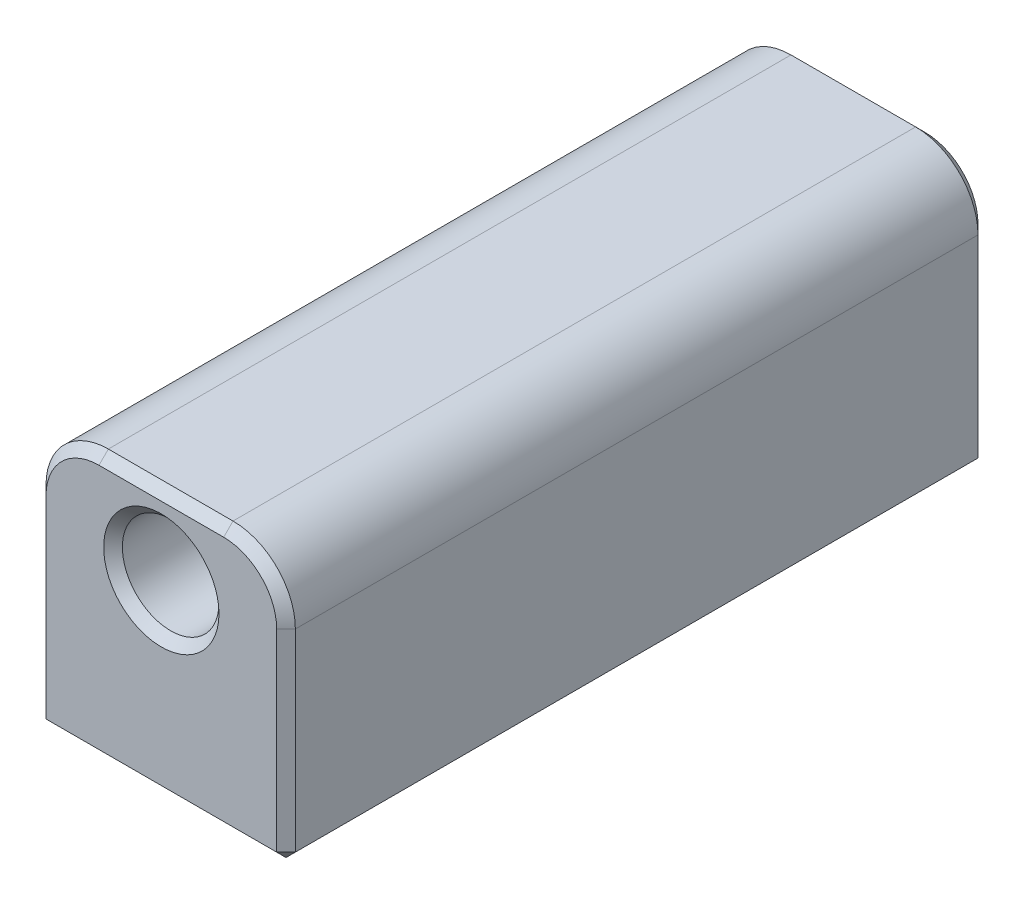
ISO-10303-21;
HEADER;
FILE_DESCRIPTION(('STEP AP214'),'2;1');
FILE_NAME('part.step','',(''),(''),'','','');
FILE_SCHEMA(('AUTOMOTIVE_DESIGN { 1 0 10303 214 1 1 1 1 }'));
ENDSEC;
DATA;
#1=APPLICATION_CONTEXT('core data for automotive mechanical design processes');
#2=APPLICATION_PROTOCOL_DEFINITION('international standard','automotive_design',2000,#1);
#3=PRODUCT_CONTEXT('',#1,'mechanical');
#4=PRODUCT('Part','Part','',(#3));
#5=PRODUCT_RELATED_PRODUCT_CATEGORY('part','',(#4));
#6=PRODUCT_DEFINITION_FORMATION('','',#4);
#7=PRODUCT_DEFINITION_CONTEXT('part definition',#1,'design');
#8=PRODUCT_DEFINITION('design','',#6,#7);
#9=PRODUCT_DEFINITION_SHAPE('','',#8);
#10=(LENGTH_UNIT() NAMED_UNIT(*) SI_UNIT(.MILLI.,.METRE.));
#11=(NAMED_UNIT(*) PLANE_ANGLE_UNIT() SI_UNIT($,.RADIAN.));
#12=(NAMED_UNIT(*) SI_UNIT($,.STERADIAN.) SOLID_ANGLE_UNIT());
#13=UNCERTAINTY_MEASURE_WITH_UNIT(LENGTH_MEASURE(1.E-05),#10,'distance_accuracy_value','');
#14=(GEOMETRIC_REPRESENTATION_CONTEXT(3) GLOBAL_UNCERTAINTY_ASSIGNED_CONTEXT((#13)) GLOBAL_UNIT_ASSIGNED_CONTEXT((#10,
#11,#12)) REPRESENTATION_CONTEXT('',''));
#15=CARTESIAN_POINT('',(0.,0.,0.));
#16=DIRECTION('',(0.,0.,1.));
#17=DIRECTION('',(1.,0.,0.));
#18=AXIS2_PLACEMENT_3D('',#15,#16,#17);
#19=CARTESIAN_POINT('',(-5.08,10.795,0.));
#20=DIRECTION('',(-1.,0.,0.));
#21=DIRECTION('',(0.,0.,1.));
#22=AXIS2_PLACEMENT_3D('',#19,#20,#21);
#23=PLANE('',#22);
#24=DIRECTION('',(0.,0.,-1.));
#25=VECTOR('',#24,1.);
#26=CARTESIAN_POINT('',(-5.08,8.255,0.));
#27=LINE('',#26,#25);
#28=CARTESIAN_POINT('',(-5.08,8.255,13.9065));
#29=VERTEX_POINT('',#28);
#30=CARTESIAN_POINT('',(-5.08,8.255,-13.9065));
#31=VERTEX_POINT('',#30);
#32=EDGE_CURVE('E205',#29,#31,#27,.T.);
#33=ORIENTED_EDGE('',*,*,#32,.T.);
#34=DIRECTION('',(0.,-1.,0.));
#35=VECTOR('',#34,1.);
#36=CARTESIAN_POINT('',(-5.08,0.,-13.9065));
#37=LINE('',#36,#35);
#38=CARTESIAN_POINT('',(-5.08,0.380999999999999,-13.9065));
#39=VERTEX_POINT('',#38);
#40=EDGE_CURVE('E376',#31,#39,#37,.T.);
#41=ORIENTED_EDGE('',*,*,#40,.T.);
#42=DIRECTION('',(0.,0.,1.));
#43=VECTOR('',#42,1.);
#44=CARTESIAN_POINT('',(-5.08,0.380999999999999,14.2875));
#45=LINE('',#44,#43);
#46=CARTESIAN_POINT('',(-5.08,0.380999999999999,13.9065));
#47=VERTEX_POINT('',#46);
#48=EDGE_CURVE('E369',#39,#47,#45,.T.);
#49=ORIENTED_EDGE('',*,*,#48,.T.);
#50=DIRECTION('',(0.,1.,0.));
#51=VECTOR('',#50,1.);
#52=CARTESIAN_POINT('',(-5.08,10.795,13.9065));
#53=LINE('',#52,#51);
#54=EDGE_CURVE('E373',#47,#29,#53,.T.);
#55=ORIENTED_EDGE('',*,*,#54,.T.);
#56=EDGE_LOOP('',(#33,#41,#49,#55));
#57=FACE_BOUND('',#56,.T.);
#58=ADVANCED_FACE('F52',(#57),#23,.T.);
#59=CARTESIAN_POINT('',(0.,10.795,14.2875));
#60=DIRECTION('',(0.,0.,1.));
#61=DIRECTION('',(1.,0.,0.));
#62=AXIS2_PLACEMENT_3D('',#59,#60,#61);
#63=PLANE('',#62);
#64=CARTESIAN_POINT('',(0.,7.62,14.2875));
#65=DIRECTION('',(0.,0.,1.));
#66=DIRECTION('',(1.,0.,0.));
#67=AXIS2_PLACEMENT_3D('',#64,#65,#66);
#68=CIRCLE('',#67,2.34950000000003);
#69=CARTESIAN_POINT('',(2.34950000000003,7.62,14.2875));
#70=VERTEX_POINT('',#69);
#71=EDGE_CURVE('E350',#70,#70,#68,.F.);
#72=ORIENTED_EDGE('',*,*,#71,.T.);
#73=EDGE_LOOP('',(#72));
#74=FACE_BOUND('',#73,.T.);
#75=CARTESIAN_POINT('',(-2.54,8.255,14.2875));
#76=DIRECTION('',(0.,0.,1.));
#77=DIRECTION('',(1.,0.,0.));
#78=AXIS2_PLACEMENT_3D('',#75,#76,#77);
#79=CIRCLE('',#78,2.159);
#80=CARTESIAN_POINT('',(-2.54,10.414,14.2875));
#81=VERTEX_POINT('',#80);
#82=CARTESIAN_POINT('',(-4.699,8.255,14.2875));
#83=VERTEX_POINT('',#82);
#84=EDGE_CURVE('E338',#81,#83,#79,.T.);
#85=ORIENTED_EDGE('',*,*,#84,.T.);
#86=DIRECTION('',(0.,-1.,0.));
#87=VECTOR('',#86,1.);
#88=CARTESIAN_POINT('',(-4.699,10.795,14.2875));
#89=LINE('',#88,#87);
#90=CARTESIAN_POINT('',(-4.699,0.380999999999999,14.2875));
#91=VERTEX_POINT('',#90);
#92=EDGE_CURVE('E344',#83,#91,#89,.T.);
#93=ORIENTED_EDGE('',*,*,#92,.T.);
#94=DIRECTION('',(1.,0.,0.));
#95=VECTOR('',#94,1.);
#96=CARTESIAN_POINT('',(5.08,0.380999999999999,14.2875));
#97=LINE('',#96,#95);
#98=CARTESIAN_POINT('',(4.699,0.380999999999999,14.2875));
#99=VERTEX_POINT('',#98);
#100=EDGE_CURVE('E333',#91,#99,#97,.T.);
#101=ORIENTED_EDGE('',*,*,#100,.T.);
#102=DIRECTION('',(0.,1.,0.));
#103=VECTOR('',#102,1.);
#104=CARTESIAN_POINT('',(4.699,8.255,14.2875));
#105=LINE('',#104,#103);
#106=CARTESIAN_POINT('',(4.699,8.255,14.2875));
#107=VERTEX_POINT('',#106);
#108=EDGE_CURVE('E329',#99,#107,#105,.T.);
#109=ORIENTED_EDGE('',*,*,#108,.T.);
#110=CARTESIAN_POINT('',(2.54,8.255,14.2875));
#111=DIRECTION('',(0.,0.,1.));
#112=DIRECTION('',(1.,0.,0.));
#113=AXIS2_PLACEMENT_3D('',#110,#111,#112);
#114=CIRCLE('',#113,2.159);
#115=CARTESIAN_POINT('',(2.54,10.414,14.2875));
#116=VERTEX_POINT('',#115);
#117=EDGE_CURVE('E337',#107,#116,#114,.T.);
#118=ORIENTED_EDGE('',*,*,#117,.T.);
#119=DIRECTION('',(-1.,0.,0.));
#120=VECTOR('',#119,1.);
#121=CARTESIAN_POINT('',(0.,10.414,14.2875));
#122=LINE('',#121,#120);
#123=EDGE_CURVE('E336',#116,#81,#122,.T.);
#124=ORIENTED_EDGE('',*,*,#123,.T.);
#125=EDGE_LOOP('',(#85,#93,#101,#109,#118,#124));
#126=FACE_BOUND('',#125,.T.);
#127=ADVANCED_FACE('F484',(#74,#126),#63,.T.);
#128=CARTESIAN_POINT('',(5.08,10.795,0.));
#129=DIRECTION('',(-1.,0.,0.));
#130=DIRECTION('',(0.,0.,1.));
#131=AXIS2_PLACEMENT_3D('',#128,#129,#130);
#132=PLANE('',#131);
#133=DIRECTION('',(0.,0.,-1.));
#134=VECTOR('',#133,1.);
#135=CARTESIAN_POINT('',(5.08,0.380999999999999,0.));
#136=LINE('',#135,#134);
#137=CARTESIAN_POINT('',(5.08,0.380999999999999,13.9065));
#138=VERTEX_POINT('',#137);
#139=CARTESIAN_POINT('',(5.08,0.380999999999999,-13.9065));
#140=VERTEX_POINT('',#139);
#141=EDGE_CURVE('E63',#138,#140,#136,.T.);
#142=ORIENTED_EDGE('',*,*,#141,.T.);
#143=DIRECTION('',(0.,1.,0.));
#144=VECTOR('',#143,1.);
#145=CARTESIAN_POINT('',(5.08,10.795,-13.9065));
#146=LINE('',#145,#144);
#147=CARTESIAN_POINT('',(5.08,8.255,-13.9065));
#148=VERTEX_POINT('',#147);
#149=EDGE_CURVE('E11',#140,#148,#146,.T.);
#150=ORIENTED_EDGE('',*,*,#149,.T.);
#151=DIRECTION('',(0.,0.,-1.));
#152=VECTOR('',#151,1.);
#153=CARTESIAN_POINT('',(5.08,8.255,14.2875));
#154=LINE('',#153,#152);
#155=CARTESIAN_POINT('',(5.08,8.255,13.9065));
#156=VERTEX_POINT('',#155);
#157=EDGE_CURVE('E300',#148,#156,#154,.F.);
#158=ORIENTED_EDGE('',*,*,#157,.T.);
#159=DIRECTION('',(0.,-1.,0.));
#160=VECTOR('',#159,1.);
#161=CARTESIAN_POINT('',(5.08,0.,13.9065));
#162=LINE('',#161,#160);
#163=EDGE_CURVE('E81',#156,#138,#162,.T.);
#164=ORIENTED_EDGE('',*,*,#163,.T.);
#165=EDGE_LOOP('',(#142,#150,#158,#164));
#166=FACE_BOUND('',#165,.T.);
#167=ADVANCED_FACE('F432',(#166),#132,.F.);
#168=CARTESIAN_POINT('',(0.,10.795,-14.2875));
#169=DIRECTION('',(0.,0.,1.));
#170=DIRECTION('',(1.,0.,0.));
#171=AXIS2_PLACEMENT_3D('',#168,#169,#170);
#172=PLANE('',#171);
#173=CARTESIAN_POINT('',(0.,7.62,-14.2875));
#174=DIRECTION('',(0.,0.,1.));
#175=DIRECTION('',(1.,0.,0.));
#176=AXIS2_PLACEMENT_3D('',#173,#174,#175);
#177=CIRCLE('',#176,2.34949999999998);
#178=CARTESIAN_POINT('',(2.34949999999998,7.62,-14.2875));
#179=VERTEX_POINT('',#178);
#180=EDGE_CURVE('E366',#179,#179,#177,.T.);
#181=ORIENTED_EDGE('',*,*,#180,.T.);
#182=EDGE_LOOP('',(#181));
#183=FACE_BOUND('',#182,.T.);
#184=DIRECTION('',(-1.,0.,0.));
#185=VECTOR('',#184,1.);
#186=CARTESIAN_POINT('',(0.,0.380999999999999,-14.2875));
#187=LINE('',#186,#185);
#188=CARTESIAN_POINT('',(4.699,0.380999999999999,-14.2875));
#189=VERTEX_POINT('',#188);
#190=CARTESIAN_POINT('',(-4.699,0.380999999999999,-14.2875));
#191=VERTEX_POINT('',#190);
#192=EDGE_CURVE('E215',#189,#191,#187,.T.);
#193=ORIENTED_EDGE('',*,*,#192,.T.);
#194=DIRECTION('',(0.,1.,0.));
#195=VECTOR('',#194,1.);
#196=CARTESIAN_POINT('',(-4.699,8.255,-14.2875));
#197=LINE('',#196,#195);
#198=CARTESIAN_POINT('',(-4.699,8.255,-14.2875));
#199=VERTEX_POINT('',#198);
#200=EDGE_CURVE('E365',#191,#199,#197,.T.);
#201=ORIENTED_EDGE('',*,*,#200,.T.);
#202=CARTESIAN_POINT('',(-2.54,8.255,-14.2875));
#203=DIRECTION('',(0.,0.,1.));
#204=DIRECTION('',(1.,0.,0.));
#205=AXIS2_PLACEMENT_3D('',#202,#203,#204);
#206=CIRCLE('',#205,2.159);
#207=CARTESIAN_POINT('',(-2.54,10.414,-14.2875));
#208=VERTEX_POINT('',#207);
#209=EDGE_CURVE('E360',#199,#208,#206,.F.);
#210=ORIENTED_EDGE('',*,*,#209,.T.);
#211=DIRECTION('',(1.,0.,0.));
#212=VECTOR('',#211,1.);
#213=CARTESIAN_POINT('',(2.54,10.414,-14.2875));
#214=LINE('',#213,#212);
#215=CARTESIAN_POINT('',(2.54,10.414,-14.2875));
#216=VERTEX_POINT('',#215);
#217=EDGE_CURVE('E357',#208,#216,#214,.T.);
#218=ORIENTED_EDGE('',*,*,#217,.T.);
#219=CARTESIAN_POINT('',(2.54,8.255,-14.2875));
#220=DIRECTION('',(0.,0.,1.));
#221=DIRECTION('',(1.,0.,0.));
#222=AXIS2_PLACEMENT_3D('',#219,#220,#221);
#223=CIRCLE('',#222,2.159);
#224=CARTESIAN_POINT('',(4.699,8.255,-14.2875));
#225=VERTEX_POINT('',#224);
#226=EDGE_CURVE('E354',#216,#225,#223,.F.);
#227=ORIENTED_EDGE('',*,*,#226,.T.);
#228=DIRECTION('',(0.,-1.,0.));
#229=VECTOR('',#228,1.);
#230=CARTESIAN_POINT('',(4.699,10.795,-14.2875));
#231=LINE('',#230,#229);
#232=EDGE_CURVE('E353',#225,#189,#231,.T.);
#233=ORIENTED_EDGE('',*,*,#232,.T.);
#234=EDGE_LOOP('',(#193,#201,#210,#218,#227,#233));
#235=FACE_BOUND('',#234,.T.);
#236=ADVANCED_FACE('F424',(#183,#235),#172,.F.);
#237=CARTESIAN_POINT('',(0.,10.795,0.));
#238=DIRECTION('',(0.,1.,0.));
#239=DIRECTION('',(0.,0.,1.));
#240=AXIS2_PLACEMENT_3D('',#237,#238,#239);
#241=PLANE('',#240);
#242=DIRECTION('',(0.,0.,-1.));
#243=VECTOR('',#242,1.);
#244=CARTESIAN_POINT('',(2.54,10.795,-14.2875));
#245=LINE('',#244,#243);
#246=CARTESIAN_POINT('',(2.54,10.795,13.9065));
#247=VERTEX_POINT('',#246);
#248=CARTESIAN_POINT('',(2.54,10.795,-13.9065));
#249=VERTEX_POINT('',#248);
#250=EDGE_CURVE('E295',#247,#249,#245,.T.);
#251=ORIENTED_EDGE('',*,*,#250,.T.);
#252=DIRECTION('',(-1.,0.,0.));
#253=VECTOR('',#252,1.);
#254=CARTESIAN_POINT('',(-2.54,10.795,-13.9065));
#255=LINE('',#254,#253);
#256=CARTESIAN_POINT('',(-2.54,10.795,-13.9065));
#257=VERTEX_POINT('',#256);
#258=EDGE_CURVE('E389',#249,#257,#255,.T.);
#259=ORIENTED_EDGE('',*,*,#258,.T.);
#260=DIRECTION('',(0.,0.,-1.));
#261=VECTOR('',#260,1.);
#262=CARTESIAN_POINT('',(-2.54,10.795,0.));
#263=LINE('',#262,#261);
#264=CARTESIAN_POINT('',(-2.54,10.795,13.9065));
#265=VERTEX_POINT('',#264);
#266=EDGE_CURVE('E287',#257,#265,#263,.F.);
#267=ORIENTED_EDGE('',*,*,#266,.T.);
#268=DIRECTION('',(1.,0.,0.));
#269=VECTOR('',#268,1.);
#270=CARTESIAN_POINT('',(0.,10.795,13.9065));
#271=LINE('',#270,#269);
#272=EDGE_CURVE('E386',#265,#247,#271,.T.);
#273=ORIENTED_EDGE('',*,*,#272,.T.);
#274=EDGE_LOOP('',(#251,#259,#267,#273));
#275=FACE_BOUND('',#274,.T.);
#276=ADVANCED_FACE('F470',(#275),#241,.T.);
#277=CARTESIAN_POINT('',(0.,0.,0.));
#278=DIRECTION('',(0.,1.,0.));
#279=DIRECTION('',(0.,0.,1.));
#280=AXIS2_PLACEMENT_3D('',#277,#278,#279);
#281=PLANE('',#280);
#282=CARTESIAN_POINT('',(0.,0.,-6.35));
#283=DIRECTION('',(0.,1.,0.));
#284=DIRECTION('',(0.,0.,1.));
#285=AXIS2_PLACEMENT_3D('',#282,#283,#284);
#286=CIRCLE('',#285,2.41299999999999);
#287=CARTESIAN_POINT('',(0.,0.,-3.937));
#288=VERTEX_POINT('',#287);
#289=EDGE_CURVE('E311',#288,#288,#286,.T.);
#290=ORIENTED_EDGE('',*,*,#289,.T.);
#291=EDGE_LOOP('',(#290));
#292=FACE_BOUND('',#291,.T.);
#293=CARTESIAN_POINT('',(0.,0.,6.35));
#294=DIRECTION('',(0.,1.,0.));
#295=DIRECTION('',(0.,0.,1.));
#296=AXIS2_PLACEMENT_3D('',#293,#294,#295);
#297=CIRCLE('',#296,2.41299999999999);
#298=CARTESIAN_POINT('',(0.,0.,8.76299999999999));
#299=VERTEX_POINT('',#298);
#300=EDGE_CURVE('E310',#299,#299,#297,.T.);
#301=ORIENTED_EDGE('',*,*,#300,.T.);
#302=EDGE_LOOP('',(#301));
#303=FACE_BOUND('',#302,.T.);
#304=DIRECTION('',(0.,0.,1.));
#305=VECTOR('',#304,1.);
#306=CARTESIAN_POINT('',(4.699,0.,0.));
#307=LINE('',#306,#305);
#308=CARTESIAN_POINT('',(4.699,0.,-13.9065));
#309=VERTEX_POINT('',#308);
#310=CARTESIAN_POINT('',(4.699,0.,13.9065));
#311=VERTEX_POINT('',#310);
#312=EDGE_CURVE('E182',#309,#311,#307,.T.);
#313=ORIENTED_EDGE('',*,*,#312,.T.);
#314=DIRECTION('',(-1.,0.,0.));
#315=VECTOR('',#314,1.);
#316=CARTESIAN_POINT('',(-5.08,0.,13.9065));
#317=LINE('',#316,#315);
#318=CARTESIAN_POINT('',(-4.699,0.,13.9065));
#319=VERTEX_POINT('',#318);
#320=EDGE_CURVE('E302',#311,#319,#317,.T.);
#321=ORIENTED_EDGE('',*,*,#320,.T.);
#322=DIRECTION('',(0.,0.,-1.));
#323=VECTOR('',#322,1.);
#324=CARTESIAN_POINT('',(-4.699,0.,-14.2875));
#325=LINE('',#324,#323);
#326=CARTESIAN_POINT('',(-4.699,0.,-13.9065));
#327=VERTEX_POINT('',#326);
#328=EDGE_CURVE('E184',#319,#327,#325,.T.);
#329=ORIENTED_EDGE('',*,*,#328,.T.);
#330=DIRECTION('',(1.,0.,0.));
#331=VECTOR('',#330,1.);
#332=CARTESIAN_POINT('',(0.,0.,-13.9065));
#333=LINE('',#332,#331);
#334=EDGE_CURVE('E177',#327,#309,#333,.T.);
#335=ORIENTED_EDGE('',*,*,#334,.T.);
#336=EDGE_LOOP('',(#313,#321,#329,#335));
#337=FACE_BOUND('',#336,.T.);
#338=ADVANCED_FACE('F181',(#292,#303,#337),#281,.F.);
#339=CARTESIAN_POINT('',(0.,5.08,-6.35));
#340=DIRECTION('',(0.,-1.,0.));
#341=DIRECTION('',(0.,0.,-1.));
#342=AXIS2_PLACEMENT_3D('',#339,#340,#341);
#343=CYLINDRICAL_SURFACE('',#342,2.032);
#344=CARTESIAN_POINT('',(0.,0.380999999999999,-6.35));
#345=DIRECTION('',(0.,1.,0.));
#346=DIRECTION('',(0.,0.,1.));
#347=AXIS2_PLACEMENT_3D('',#344,#345,#346);
#348=CIRCLE('',#347,2.032);
#349=CARTESIAN_POINT('',(0.,0.380999999999999,-4.318));
#350=VERTEX_POINT('',#349);
#351=EDGE_CURVE('E314',#350,#350,#348,.F.);
#352=ORIENTED_EDGE('',*,*,#351,.T.);
#353=EDGE_LOOP('',(#352));
#354=FACE_BOUND('',#353,.T.);
#355=CARTESIAN_POINT('',(0.,5.08,-6.35));
#356=DIRECTION('',(0.,1.,0.));
#357=DIRECTION('',(0.,0.,1.));
#358=AXIS2_PLACEMENT_3D('',#355,#356,#357);
#359=CIRCLE('',#358,2.032);
#360=CARTESIAN_POINT('',(0.,5.08,-4.318));
#361=VERTEX_POINT('',#360);
#362=EDGE_CURVE('E275',#361,#361,#359,.T.);
#363=ORIENTED_EDGE('',*,*,#362,.T.);
#364=EDGE_LOOP('',(#363));
#365=FACE_BOUND('',#364,.T.);
#366=ADVANCED_FACE('F658',(#354,#365),#343,.F.);
#367=CARTESIAN_POINT('',(0.,5.08,0.));
#368=DIRECTION('',(0.,1.,0.));
#369=DIRECTION('',(0.,0.,1.));
#370=AXIS2_PLACEMENT_3D('',#367,#368,#369);
#371=PLANE('',#370);
#372=ORIENTED_EDGE('',*,*,#362,.F.);
#373=EDGE_LOOP('',(#372));
#374=FACE_BOUND('',#373,.T.);
#375=ADVANCED_FACE('F651',(#374),#371,.F.);
#376=CARTESIAN_POINT('',(0.,5.08,6.35));
#377=DIRECTION('',(0.,-1.,0.));
#378=DIRECTION('',(0.,0.,-1.));
#379=AXIS2_PLACEMENT_3D('',#376,#377,#378);
#380=CYLINDRICAL_SURFACE('',#379,2.032);
#381=CARTESIAN_POINT('',(0.,0.380999999999999,6.35));
#382=DIRECTION('',(0.,1.,0.));
#383=DIRECTION('',(0.,0.,1.));
#384=AXIS2_PLACEMENT_3D('',#381,#382,#383);
#385=CIRCLE('',#384,2.032);
#386=CARTESIAN_POINT('',(0.,0.380999999999999,8.382));
#387=VERTEX_POINT('',#386);
#388=EDGE_CURVE('E319',#387,#387,#385,.F.);
#389=ORIENTED_EDGE('',*,*,#388,.T.);
#390=EDGE_LOOP('',(#389));
#391=FACE_BOUND('',#390,.T.);
#392=CARTESIAN_POINT('',(0.,5.08,6.35));
#393=DIRECTION('',(0.,1.,0.));
#394=DIRECTION('',(0.,0.,1.));
#395=AXIS2_PLACEMENT_3D('',#392,#393,#394);
#396=CIRCLE('',#395,2.032);
#397=CARTESIAN_POINT('',(0.,5.08,8.382));
#398=VERTEX_POINT('',#397);
#399=EDGE_CURVE('E281',#398,#398,#396,.T.);
#400=ORIENTED_EDGE('',*,*,#399,.T.);
#401=EDGE_LOOP('',(#400));
#402=FACE_BOUND('',#401,.T.);
#403=ADVANCED_FACE('F647',(#391,#402),#380,.F.);
#404=CARTESIAN_POINT('',(0.,5.08,0.));
#405=DIRECTION('',(0.,1.,0.));
#406=DIRECTION('',(0.,0.,1.));
#407=AXIS2_PLACEMENT_3D('',#404,#405,#406);
#408=PLANE('',#407);
#409=ORIENTED_EDGE('',*,*,#399,.F.);
#410=EDGE_LOOP('',(#409));
#411=FACE_BOUND('',#410,.T.);
#412=ADVANCED_FACE('F639',(#411),#408,.F.);
#413=CARTESIAN_POINT('',(0.,7.62,-14.2875));
#414=DIRECTION('',(0.,0.,1.));
#415=DIRECTION('',(1.,0.,0.));
#416=AXIS2_PLACEMENT_3D('',#413,#414,#415);
#417=CYLINDRICAL_SURFACE('',#416,1.9685);
#418=CARTESIAN_POINT('',(0.,7.62,13.9065));
#419=DIRECTION('',(0.,0.,1.));
#420=DIRECTION('',(1.,0.,0.));
#421=AXIS2_PLACEMENT_3D('',#418,#419,#420);
#422=CIRCLE('',#421,1.9685);
#423=CARTESIAN_POINT('',(1.9685,7.62,13.9065));
#424=VERTEX_POINT('',#423);
#425=EDGE_CURVE('E326',#424,#424,#422,.T.);
#426=CARTESIAN_POINT('',(0.,7.62,-13.9065));
#427=DIRECTION('',(0.,0.,1.));
#428=DIRECTION('',(1.,0.,0.));
#429=AXIS2_PLACEMENT_3D('',#426,#427,#428);
#430=CIRCLE('',#429,1.9685);
#431=CARTESIAN_POINT('',(1.9685,7.62,-13.9065));
#432=VERTEX_POINT('',#431);
#433=EDGE_CURVE('E322',#432,#432,#430,.F.);
#434=CARTESIAN_POINT('',(1.9685,7.62,13.9065));
#435=CARTESIAN_POINT('',(1.9685,7.62,13.61678125));
#436=CARTESIAN_POINT('',(1.9685,7.62,13.3270625));
#437=CARTESIAN_POINT('',(1.9685,7.62,12.747625));
#438=CARTESIAN_POINT('',(1.9685,7.62,12.45790625));
#439=CARTESIAN_POINT('',(1.9685,7.62,11.87846875));
#440=CARTESIAN_POINT('',(1.9685,7.62,11.58875));
#441=CARTESIAN_POINT('',(1.9685,7.62,11.0093125));
#442=CARTESIAN_POINT('',(1.9685,7.62,10.71959375));
#443=CARTESIAN_POINT('',(1.9685,7.62,10.14015625));
#444=CARTESIAN_POINT('',(1.9685,7.62,9.85043749999997));
#445=CARTESIAN_POINT('',(1.9685,7.62,9.27099999999997));
#446=CARTESIAN_POINT('',(1.9685,7.62,8.98128124999997));
#447=CARTESIAN_POINT('',(1.9685,7.62,8.40184374999997));
#448=CARTESIAN_POINT('',(1.9685,7.62,8.11212499999997));
#449=CARTESIAN_POINT('',(1.9685,7.62,7.53268749999997));
#450=CARTESIAN_POINT('',(1.9685,7.62,7.24296874999997));
#451=CARTESIAN_POINT('',(1.9685,7.62,6.66353124999997));
#452=CARTESIAN_POINT('',(1.9685,7.62,6.37381249999997));
#453=CARTESIAN_POINT('',(1.9685,7.62,5.79437499999997));
#454=CARTESIAN_POINT('',(1.9685,7.62,5.50465624999997));
#455=CARTESIAN_POINT('',(1.9685,7.62,4.92521874999997));
#456=CARTESIAN_POINT('',(1.9685,7.62,4.63549999999997));
#457=CARTESIAN_POINT('',(1.9685,7.62,4.05606249999997));
#458=CARTESIAN_POINT('',(1.9685,7.62,3.76634374999997));
#459=CARTESIAN_POINT('',(1.9685,7.62,3.18690624999997));
#460=CARTESIAN_POINT('',(1.9685,7.62,2.89718749999997));
#461=CARTESIAN_POINT('',(1.9685,7.62,2.31774999999997));
#462=CARTESIAN_POINT('',(1.9685,7.62,2.02803124999997));
#463=CARTESIAN_POINT('',(1.9685,7.62,1.44859374999997));
#464=CARTESIAN_POINT('',(1.9685,7.62,1.15887499999997));
#465=CARTESIAN_POINT('',(1.9685,7.62,0.579437499999973));
#466=CARTESIAN_POINT('',(1.9685,7.62,0.289718749999974));
#467=CARTESIAN_POINT('',(1.9685,7.62,-0.289718750000026));
#468=CARTESIAN_POINT('',(1.9685,7.62,-0.579437500000026));
#469=CARTESIAN_POINT('',(1.9685,7.62,-1.15887500000003));
#470=CARTESIAN_POINT('',(1.9685,7.62,-1.44859375000003));
#471=CARTESIAN_POINT('',(1.9685,7.62,-2.02803125000003));
#472=CARTESIAN_POINT('',(1.9685,7.62,-2.31775000000003));
#473=CARTESIAN_POINT('',(1.9685,7.62,-2.89718750000003));
#474=CARTESIAN_POINT('',(1.9685,7.62,-3.18690625000003));
#475=CARTESIAN_POINT('',(1.9685,7.62,-3.76634375000002));
#476=CARTESIAN_POINT('',(1.9685,7.62,-4.05606250000002));
#477=CARTESIAN_POINT('',(1.9685,7.62,-4.63550000000002));
#478=CARTESIAN_POINT('',(1.9685,7.62,-4.92521875000002));
#479=CARTESIAN_POINT('',(1.9685,7.62,-5.50465625000002));
#480=CARTESIAN_POINT('',(1.9685,7.62,-5.79437500000002));
#481=CARTESIAN_POINT('',(1.9685,7.62,-6.37381250000002));
#482=CARTESIAN_POINT('',(1.9685,7.62,-6.66353125000002));
#483=CARTESIAN_POINT('',(1.9685,7.62,-7.24296875000002));
#484=CARTESIAN_POINT('',(1.9685,7.62,-7.53268750000002));
#485=CARTESIAN_POINT('',(1.9685,7.62,-8.11212500000002));
#486=CARTESIAN_POINT('',(1.9685,7.62,-8.40184375000002));
#487=CARTESIAN_POINT('',(1.9685,7.62,-8.98128125000002));
#488=CARTESIAN_POINT('',(1.9685,7.62,-9.27100000000002));
#489=CARTESIAN_POINT('',(1.9685,7.62,-9.85043750000002));
#490=CARTESIAN_POINT('',(1.9685,7.62,-10.14015625));
#491=CARTESIAN_POINT('',(1.9685,7.62,-10.71959375));
#492=CARTESIAN_POINT('',(1.9685,7.62,-11.0093125));
#493=CARTESIAN_POINT('',(1.9685,7.62,-11.58875));
#494=CARTESIAN_POINT('',(1.9685,7.62,-11.87846875));
#495=CARTESIAN_POINT('',(1.9685,7.62,-12.45790625));
#496=CARTESIAN_POINT('',(1.9685,7.62,-12.747625));
#497=CARTESIAN_POINT('',(1.9685,7.62,-13.3270625));
#498=CARTESIAN_POINT('',(1.9685,7.62,-13.61678125));
#499=CARTESIAN_POINT('',(1.9685,7.62,-13.9065));
#500=B_SPLINE_CURVE_WITH_KNOTS('',3,(#434,#435,#436,#437,#438,#439,#440,#441,#442,#443,#444,
#445,#446,#447,#448,#449,#450,#451,#452,#453,#454,#455,#456,#457,#458,#459,#460,#461,#462,#463,
#464,#465,#466,#467,#468,#469,#470,#471,#472,#473,#474,#475,#476,#477,#478,#479,#480,#481,#482,
#483,#484,#485,#486,#487,#488,#489,#490,#491,#492,#493,#494,#495,#496,#497,#498,#499),
.UNSPECIFIED.,.F.,.F.,(4,2,2,2,2,2,2,2,2,2,2,2,2,2,2,2,2,2,2,2,2,2,2,2,2,2,2,2,2,2,2,2,4),(0.,
0.869156249999999,1.7383125,2.60746875,3.476625,4.34578125,5.2149375,6.08409375,6.95325,
7.82240625,8.6915625,9.56071875,10.429875,11.29903125,12.1681875,13.03734375,13.9065,
14.77565625,15.6448125,16.51396875,17.383125,18.25228125,19.1214375,19.99059375,20.85975,
21.72890625,22.5980625,23.46721875,24.336375,25.20553125,26.0746875,26.94384375,27.813),.UNSPECIFIED.);
#501=EDGE_CURVE('BSEAM500',#424,#432,#500,.T.);
#502=ORIENTED_EDGE('',*,*,#425,.T.);
#503=ORIENTED_EDGE('',*,*,#433,.T.);
#504=ORIENTED_EDGE('',*,*,#501,.T.);
#505=ORIENTED_EDGE('',*,*,#501,.F.);
#506=EDGE_LOOP('',(#502,#504,#503,#505));
#507=FACE_BOUND('',#506,.T.);
#508=ADVANCED_FACE('F500',(#507),#417,.F.);
#509=CARTESIAN_POINT('',(2.54,8.255,0.));
#510=DIRECTION('',(0.,0.,1.));
#511=DIRECTION('',(1.,0.,0.));
#512=AXIS2_PLACEMENT_3D('',#509,#510,#511);
#513=CYLINDRICAL_SURFACE('',#512,2.54);
#514=ORIENTED_EDGE('',*,*,#157,.F.);
#515=CARTESIAN_POINT('',(2.54,8.255,-13.9065));
#516=DIRECTION('',(0.,0.,1.));
#517=DIRECTION('',(1.,0.,0.));
#518=AXIS2_PLACEMENT_3D('',#515,#516,#517);
#519=CIRCLE('',#518,2.54);
#520=EDGE_CURVE('E395',#148,#249,#519,.T.);
#521=ORIENTED_EDGE('',*,*,#520,.T.);
#522=ORIENTED_EDGE('',*,*,#250,.F.);
#523=CARTESIAN_POINT('',(2.54,8.255,13.9065));
#524=DIRECTION('',(0.,0.,1.));
#525=DIRECTION('',(1.,0.,0.));
#526=AXIS2_PLACEMENT_3D('',#523,#524,#525);
#527=CIRCLE('',#526,2.54);
#528=EDGE_CURVE('E390',#247,#156,#527,.F.);
#529=ORIENTED_EDGE('',*,*,#528,.T.);
#530=EDGE_LOOP('',(#514,#521,#522,#529));
#531=FACE_BOUND('',#530,.T.);
#532=ADVANCED_FACE('F436',(#531),#513,.T.);
#533=CARTESIAN_POINT('',(-2.54,8.255,0.));
#534=DIRECTION('',(0.,0.,-1.));
#535=DIRECTION('',(-1.,0.,0.));
#536=AXIS2_PLACEMENT_3D('',#533,#534,#535);
#537=CYLINDRICAL_SURFACE('',#536,2.54);
#538=ORIENTED_EDGE('',*,*,#266,.F.);
#539=CARTESIAN_POINT('',(-2.54,8.255,-13.9065));
#540=DIRECTION('',(0.,0.,1.));
#541=DIRECTION('',(1.,0.,0.));
#542=AXIS2_PLACEMENT_3D('',#539,#540,#541);
#543=CIRCLE('',#542,2.54);
#544=EDGE_CURVE('E384',#257,#31,#543,.T.);
#545=ORIENTED_EDGE('',*,*,#544,.T.);
#546=ORIENTED_EDGE('',*,*,#32,.F.);
#547=CARTESIAN_POINT('',(-2.54,8.255,13.9065));
#548=DIRECTION('',(0.,0.,1.));
#549=DIRECTION('',(1.,0.,0.));
#550=AXIS2_PLACEMENT_3D('',#547,#548,#549);
#551=CIRCLE('',#550,2.54);
#552=EDGE_CURVE('E379',#29,#265,#551,.F.);
#553=ORIENTED_EDGE('',*,*,#552,.T.);
#554=EDGE_LOOP('',(#538,#545,#546,#553));
#555=FACE_BOUND('',#554,.T.);
#556=ADVANCED_FACE('F457',(#555),#537,.T.);
#557=CARTESIAN_POINT('',(0.,0.,-6.35));
#558=DIRECTION('',(0.,-1.,0.));
#559=DIRECTION('',(0.,0.,-1.));
#560=AXIS2_PLACEMENT_3D('',#557,#558,#559);
#561=CONICAL_SURFACE('',#560,2.41299999999999,0.785398163397445);
#562=ORIENTED_EDGE('',*,*,#351,.F.);
#563=EDGE_LOOP('',(#562));
#564=FACE_BOUND('',#563,.T.);
#565=ORIENTED_EDGE('',*,*,#289,.F.);
#566=EDGE_LOOP('',(#565));
#567=FACE_BOUND('',#566,.T.);
#568=ADVANCED_FACE('F499',(#564,#567),#561,.F.);
#569=CARTESIAN_POINT('',(0.,0.,6.35));
#570=DIRECTION('',(0.,-1.,0.));
#571=DIRECTION('',(0.,0.,-1.));
#572=AXIS2_PLACEMENT_3D('',#569,#570,#571);
#573=CONICAL_SURFACE('',#572,2.41299999999999,0.785398163397445);
#574=ORIENTED_EDGE('',*,*,#388,.F.);
#575=EDGE_LOOP('',(#574));
#576=FACE_BOUND('',#575,.T.);
#577=ORIENTED_EDGE('',*,*,#300,.F.);
#578=EDGE_LOOP('',(#577));
#579=FACE_BOUND('',#578,.T.);
#580=ADVANCED_FACE('F510',(#576,#579),#573,.F.);
#581=CARTESIAN_POINT('',(0.,7.62,13.9065));
#582=DIRECTION('',(0.,0.,1.));
#583=DIRECTION('',(1.,0.,0.));
#584=AXIS2_PLACEMENT_3D('',#581,#582,#583);
#585=CONICAL_SURFACE('',#584,1.9685,0.78539816339745);
#586=ORIENTED_EDGE('',*,*,#71,.F.);
#587=EDGE_LOOP('',(#586));
#588=FACE_BOUND('',#587,.T.);
#589=ORIENTED_EDGE('',*,*,#425,.F.);
#590=EDGE_LOOP('',(#589));
#591=FACE_BOUND('',#590,.T.);
#592=ADVANCED_FACE('F511',(#588,#591),#585,.F.);
#593=CARTESIAN_POINT('',(0.,7.62,-14.2875));
#594=DIRECTION('',(0.,0.,-1.));
#595=DIRECTION('',(-1.,0.,0.));
#596=AXIS2_PLACEMENT_3D('',#593,#594,#595);
#597=CONICAL_SURFACE('',#596,2.34949999999998,0.785398163397444);
#598=ORIENTED_EDGE('',*,*,#433,.F.);
#599=EDGE_LOOP('',(#598));
#600=FACE_BOUND('',#599,.T.);
#601=ORIENTED_EDGE('',*,*,#180,.F.);
#602=EDGE_LOOP('',(#601));
#603=FACE_BOUND('',#602,.T.);
#604=ADVANCED_FACE('F521',(#600,#603),#597,.F.);
#605=CARTESIAN_POINT('',(2.54,8.255,14.2875));
#606=DIRECTION('',(0.,0.,-1.));
#607=DIRECTION('',(-1.,0.,0.));
#608=AXIS2_PLACEMENT_3D('',#605,#606,#607);
#609=CONICAL_SURFACE('',#608,2.159,0.785398163397448);
#610=DIRECTION('',(-0.707106781186548,0.,0.707106781186548));
#611=VECTOR('',#610,1.);
#612=CARTESIAN_POINT('',(5.08,8.255,13.9065));
#613=LINE('',#612,#611);
#614=EDGE_CURVE('E265',#156,#107,#613,.T.);
#615=ORIENTED_EDGE('',*,*,#614,.F.);
#616=ORIENTED_EDGE('',*,*,#528,.F.);
#617=DIRECTION('',(0.,0.707106781186548,-0.707106781186548));
#618=VECTOR('',#617,1.);
#619=CARTESIAN_POINT('',(2.54,10.414,14.2875));
#620=LINE('',#619,#618);
#621=EDGE_CURVE('E59',#116,#247,#620,.T.);
#622=ORIENTED_EDGE('',*,*,#621,.F.);
#623=ORIENTED_EDGE('',*,*,#117,.F.);
#624=EDGE_LOOP('',(#615,#616,#622,#623));
#625=FACE_BOUND('',#624,.T.);
#626=ADVANCED_FACE('F57',(#625),#609,.T.);
#627=CARTESIAN_POINT('',(0.,10.414,14.2875));
#628=DIRECTION('',(0.,-0.707106781186548,-0.707106781186548));
#629=DIRECTION('',(-1.,0.,0.));
#630=AXIS2_PLACEMENT_3D('',#627,#628,#629);
#631=PLANE('',#630);
#632=ORIENTED_EDGE('',*,*,#621,.T.);
#633=ORIENTED_EDGE('',*,*,#272,.F.);
#634=DIRECTION('',(0.,0.707106781186548,-0.707106781186548));
#635=VECTOR('',#634,1.);
#636=CARTESIAN_POINT('',(-2.54,10.414,14.2875));
#637=LINE('',#636,#635);
#638=EDGE_CURVE('E258',#81,#265,#637,.T.);
#639=ORIENTED_EDGE('',*,*,#638,.F.);
#640=ORIENTED_EDGE('',*,*,#123,.F.);
#641=EDGE_LOOP('',(#632,#633,#639,#640));
#642=FACE_BOUND('',#641,.T.);
#643=ADVANCED_FACE('F461',(#642),#631,.F.);
#644=CARTESIAN_POINT('',(5.08,10.795,13.9065));
#645=DIRECTION('',(0.707106781186548,0.,0.707106781186548));
#646=DIRECTION('',(0.,1.,0.));
#647=AXIS2_PLACEMENT_3D('',#644,#645,#646);
#648=PLANE('',#647);
#649=ORIENTED_EDGE('',*,*,#614,.T.);
#650=ORIENTED_EDGE('',*,*,#108,.F.);
#651=DIRECTION('',(-0.707106781186547,0.,0.707106781186547));
#652=VECTOR('',#651,1.);
#653=CARTESIAN_POINT('',(4.699,0.380999999999999,14.2875));
#654=LINE('',#653,#652);
#655=EDGE_CURVE('E253',#138,#99,#654,.T.);
#656=ORIENTED_EDGE('',*,*,#655,.F.);
#657=ORIENTED_EDGE('',*,*,#163,.F.);
#658=EDGE_LOOP('',(#649,#650,#656,#657));
#659=FACE_BOUND('',#658,.T.);
#660=ADVANCED_FACE('F441',(#659),#648,.T.);
#661=CARTESIAN_POINT('',(-2.54,8.255,14.2875));
#662=DIRECTION('',(0.,0.,-1.));
#663=DIRECTION('',(-1.,0.,0.));
#664=AXIS2_PLACEMENT_3D('',#661,#662,#663);
#665=CONICAL_SURFACE('',#664,2.159,0.785398163397448);
#666=ORIENTED_EDGE('',*,*,#638,.T.);
#667=ORIENTED_EDGE('',*,*,#552,.F.);
#668=DIRECTION('',(-0.707106781186548,0.,-0.707106781186548));
#669=VECTOR('',#668,1.);
#670=CARTESIAN_POINT('',(-4.699,8.255,14.2875));
#671=LINE('',#670,#669);
#672=EDGE_CURVE('E252',#83,#29,#671,.T.);
#673=ORIENTED_EDGE('',*,*,#672,.F.);
#674=ORIENTED_EDGE('',*,*,#84,.F.);
#675=EDGE_LOOP('',(#666,#667,#673,#674));
#676=FACE_BOUND('',#675,.T.);
#677=ADVANCED_FACE('F465',(#676),#665,.T.);
#678=CARTESIAN_POINT('',(4.699,0.380999999999999,14.2875));
#679=DIRECTION('',(0.577350269189626,-0.577350269189626,0.577350269189626));
#680=DIRECTION('',(0.707106781186548,0.707106781186548,0.));
#681=AXIS2_PLACEMENT_3D('',#678,#679,#680);
#682=PLANE('',#681);
#683=DIRECTION('',(-0.707106781186548,-0.707106781186548,0.));
#684=VECTOR('',#683,1.);
#685=CARTESIAN_POINT('',(4.8895,0.1905,13.9065));
#686=LINE('',#685,#684);
#687=EDGE_CURVE('E197',#138,#311,#686,.T.);
#688=ORIENTED_EDGE('',*,*,#687,.F.);
#689=ORIENTED_EDGE('',*,*,#655,.T.);
#690=DIRECTION('',(0.,-0.707106781186547,-0.707106781186547));
#691=VECTOR('',#690,1.);
#692=CARTESIAN_POINT('',(4.699,0.380999999999999,14.2875));
#693=LINE('',#692,#691);
#694=EDGE_CURVE('E250',#311,#99,#693,.F.);
#695=ORIENTED_EDGE('',*,*,#694,.F.);
#696=EDGE_LOOP('',(#688,#689,#695));
#697=FACE_BOUND('',#696,.T.);
#698=ADVANCED_FACE('F442',(#697),#682,.T.);
#699=CARTESIAN_POINT('',(-4.699,10.795,14.2875));
#700=DIRECTION('',(0.707106781186548,0.,-0.707106781186548));
#701=DIRECTION('',(0.,-1.,0.));
#702=AXIS2_PLACEMENT_3D('',#699,#700,#701);
#703=PLANE('',#702);
#704=ORIENTED_EDGE('',*,*,#672,.T.);
#705=ORIENTED_EDGE('',*,*,#54,.F.);
#706=DIRECTION('',(0.707106781186548,0.,0.707106781186548));
#707=VECTOR('',#706,1.);
#708=CARTESIAN_POINT('',(-4.699,0.380999999999999,14.2875));
#709=LINE('',#708,#707);
#710=EDGE_CURVE('E238',#91,#47,#709,.F.);
#711=ORIENTED_EDGE('',*,*,#710,.F.);
#712=ORIENTED_EDGE('',*,*,#92,.F.);
#713=EDGE_LOOP('',(#704,#705,#711,#712));
#714=FACE_BOUND('',#713,.T.);
#715=ADVANCED_FACE('F453',(#714),#703,.F.);
#716=CARTESIAN_POINT('',(0.,0.,13.9065));
#717=DIRECTION('',(0.,-0.707106781186548,0.707106781186548));
#718=DIRECTION('',(1.,0.,0.));
#719=AXIS2_PLACEMENT_3D('',#716,#717,#718);
#720=PLANE('',#719);
#721=ORIENTED_EDGE('',*,*,#694,.T.);
#722=ORIENTED_EDGE('',*,*,#100,.F.);
#723=DIRECTION('',(0.,0.707106781186547,0.707106781186547));
#724=VECTOR('',#723,1.);
#725=CARTESIAN_POINT('',(-4.699,0.380999999999999,14.2875));
#726=LINE('',#725,#724);
#727=EDGE_CURVE('E212',#319,#91,#726,.T.);
#728=ORIENTED_EDGE('',*,*,#727,.F.);
#729=ORIENTED_EDGE('',*,*,#320,.F.);
#730=EDGE_LOOP('',(#721,#722,#728,#729));
#731=FACE_BOUND('',#730,.T.);
#732=ADVANCED_FACE('F449',(#731),#720,.T.);
#733=CARTESIAN_POINT('',(5.08,0.380999999999999,0.));
#734=DIRECTION('',(-0.707106781186548,0.707106781186548,0.));
#735=DIRECTION('',(0.,0.,-1.));
#736=AXIS2_PLACEMENT_3D('',#733,#734,#735);
#737=PLANE('',#736);
#738=ORIENTED_EDGE('',*,*,#687,.T.);
#739=ORIENTED_EDGE('',*,*,#312,.F.);
#740=DIRECTION('',(0.707106781186547,0.707106781186547,0.));
#741=VECTOR('',#740,1.);
#742=CARTESIAN_POINT('',(4.699,0.,-13.9065));
#743=LINE('',#742,#741);
#744=EDGE_CURVE('E196',#140,#309,#743,.F.);
#745=ORIENTED_EDGE('',*,*,#744,.F.);
#746=ORIENTED_EDGE('',*,*,#141,.F.);
#747=EDGE_LOOP('',(#738,#739,#745,#746));
#748=FACE_BOUND('',#747,.T.);
#749=ADVANCED_FACE('F195',(#748),#737,.F.);
#750=CARTESIAN_POINT('',(4.699,10.795,-14.2875));
#751=DIRECTION('',(-0.707106781186546,0.,0.707106781186549));
#752=DIRECTION('',(0.,-1.,0.));
#753=AXIS2_PLACEMENT_3D('',#750,#751,#752);
#754=PLANE('',#753);
#755=DIRECTION('',(-0.707106781186549,0.,-0.707106781186546));
#756=VECTOR('',#755,1.);
#757=CARTESIAN_POINT('',(4.8895,0.381,-14.097));
#758=LINE('',#757,#756);
#759=EDGE_CURVE('E208',#189,#140,#758,.F.);
#760=ORIENTED_EDGE('',*,*,#759,.F.);
#761=ORIENTED_EDGE('',*,*,#232,.F.);
#762=DIRECTION('',(-0.70710678118655,0.,-0.707106781186545));
#763=VECTOR('',#762,1.);
#764=CARTESIAN_POINT('',(5.08,8.255,-13.9065));
#765=LINE('',#764,#763);
#766=EDGE_CURVE('E245',#148,#225,#765,.T.);
#767=ORIENTED_EDGE('',*,*,#766,.F.);
#768=ORIENTED_EDGE('',*,*,#149,.F.);
#769=EDGE_LOOP('',(#760,#761,#767,#768));
#770=FACE_BOUND('',#769,.T.);
#771=ADVANCED_FACE('F431',(#770),#754,.F.);
#772=CARTESIAN_POINT('',(2.54,8.255,-14.2875));
#773=DIRECTION('',(0.,0.,1.));
#774=DIRECTION('',(1.,0.,0.));
#775=AXIS2_PLACEMENT_3D('',#772,#773,#774);
#776=CONICAL_SURFACE('',#775,2.159,0.785398163397448);
#777=ORIENTED_EDGE('',*,*,#766,.T.);
#778=ORIENTED_EDGE('',*,*,#226,.F.);
#779=DIRECTION('',(0.,-0.707106781186549,-0.707106781186546));
#780=VECTOR('',#779,1.);
#781=CARTESIAN_POINT('',(2.54,10.795,-13.9065));
#782=LINE('',#781,#780);
#783=EDGE_CURVE('E222',#249,#216,#782,.T.);
#784=ORIENTED_EDGE('',*,*,#783,.F.);
#785=ORIENTED_EDGE('',*,*,#520,.F.);
#786=EDGE_LOOP('',(#777,#778,#784,#785));
#787=FACE_BOUND('',#786,.T.);
#788=ADVANCED_FACE('F561',(#787),#776,.T.);
#789=CARTESIAN_POINT('',(-4.699,0.380999999999999,14.2875));
#790=DIRECTION('',(-0.577350269189626,-0.577350269189626,0.577350269189626));
#791=DIRECTION('',(0.,-0.707106781186547,-0.707106781186548));
#792=AXIS2_PLACEMENT_3D('',#789,#790,#791);
#793=PLANE('',#792);
#794=ORIENTED_EDGE('',*,*,#727,.T.);
#795=ORIENTED_EDGE('',*,*,#710,.T.);
#796=DIRECTION('',(0.707106781186547,-0.707106781186547,0.));
#797=VECTOR('',#796,1.);
#798=CARTESIAN_POINT('',(-4.8895,0.1905,13.9065));
#799=LINE('',#798,#797);
#800=EDGE_CURVE('E220',#319,#47,#799,.F.);
#801=ORIENTED_EDGE('',*,*,#800,.F.);
#802=EDGE_LOOP('',(#794,#795,#801));
#803=FACE_BOUND('',#802,.T.);
#804=ADVANCED_FACE('F451',(#803),#793,.T.);
#805=CARTESIAN_POINT('',(4.699,0.,-13.9065));
#806=DIRECTION('',(0.577350269189624,-0.577350269189626,-0.577350269189628));
#807=DIRECTION('',(0.,0.707106781186548,-0.707106781186547));
#808=AXIS2_PLACEMENT_3D('',#805,#806,#807);
#809=PLANE('',#808);
#810=ORIENTED_EDGE('',*,*,#759,.T.);
#811=ORIENTED_EDGE('',*,*,#744,.T.);
#812=DIRECTION('',(0.,-0.707106781186548,0.707106781186548));
#813=VECTOR('',#812,1.);
#814=CARTESIAN_POINT('',(4.699,0.,-13.9065));
#815=LINE('',#814,#813);
#816=EDGE_CURVE('E210',#189,#309,#815,.T.);
#817=ORIENTED_EDGE('',*,*,#816,.F.);
#818=EDGE_LOOP('',(#810,#811,#817));
#819=FACE_BOUND('',#818,.T.);
#820=ADVANCED_FACE('F207',(#819),#809,.T.);
#821=CARTESIAN_POINT('',(0.,10.795,-13.9065));
#822=DIRECTION('',(0.,0.707106781186548,-0.707106781186548));
#823=DIRECTION('',(1.,0.,0.));
#824=AXIS2_PLACEMENT_3D('',#821,#822,#823);
#825=PLANE('',#824);
#826=ORIENTED_EDGE('',*,*,#783,.T.);
#827=ORIENTED_EDGE('',*,*,#217,.F.);
#828=DIRECTION('',(0.,-0.707106781186548,-0.707106781186548));
#829=VECTOR('',#828,1.);
#830=CARTESIAN_POINT('',(-2.54,10.795,-13.9065));
#831=LINE('',#830,#829);
#832=EDGE_CURVE('E218',#257,#208,#831,.T.);
#833=ORIENTED_EDGE('',*,*,#832,.F.);
#834=ORIENTED_EDGE('',*,*,#258,.F.);
#835=EDGE_LOOP('',(#826,#827,#833,#834));
#836=FACE_BOUND('',#835,.T.);
#837=ADVANCED_FACE('F472',(#836),#825,.T.);
#838=CARTESIAN_POINT('',(-4.699,0.,0.));
#839=DIRECTION('',(-0.707106781186548,-0.707106781186548,0.));
#840=DIRECTION('',(0.,0.,1.));
#841=AXIS2_PLACEMENT_3D('',#838,#839,#840);
#842=PLANE('',#841);
#843=ORIENTED_EDGE('',*,*,#800,.T.);
#844=ORIENTED_EDGE('',*,*,#48,.F.);
#845=DIRECTION('',(-0.707106781186548,0.707106781186548,0.));
#846=VECTOR('',#845,1.);
#847=CARTESIAN_POINT('',(-5.08,0.380999999999999,-13.9065));
#848=LINE('',#847,#846);
#849=EDGE_CURVE('E226',#327,#39,#848,.T.);
#850=ORIENTED_EDGE('',*,*,#849,.F.);
#851=ORIENTED_EDGE('',*,*,#328,.F.);
#852=EDGE_LOOP('',(#843,#844,#850,#851));
#853=FACE_BOUND('',#852,.T.);
#854=ADVANCED_FACE('F413',(#853),#842,.T.);
#855=CARTESIAN_POINT('',(0.,0.380999999999999,-14.2875));
#856=DIRECTION('',(0.,0.707106781186548,0.707106781186548));
#857=DIRECTION('',(-1.,0.,0.));
#858=AXIS2_PLACEMENT_3D('',#855,#856,#857);
#859=PLANE('',#858);
#860=ORIENTED_EDGE('',*,*,#816,.T.);
#861=ORIENTED_EDGE('',*,*,#334,.F.);
#862=DIRECTION('',(0.,0.707106781186547,-0.707106781186547));
#863=VECTOR('',#862,1.);
#864=CARTESIAN_POINT('',(-4.699,0.190500000000001,-14.097));
#865=LINE('',#864,#863);
#866=EDGE_CURVE('E401',#191,#327,#865,.F.);
#867=ORIENTED_EDGE('',*,*,#866,.F.);
#868=ORIENTED_EDGE('',*,*,#192,.F.);
#869=EDGE_LOOP('',(#860,#861,#867,#868));
#870=FACE_BOUND('',#869,.T.);
#871=ADVANCED_FACE('F213',(#870),#859,.F.);
#872=CARTESIAN_POINT('',(-2.54,8.255,-14.2875));
#873=DIRECTION('',(0.,0.,1.));
#874=DIRECTION('',(1.,0.,0.));
#875=AXIS2_PLACEMENT_3D('',#872,#873,#874);
#876=CONICAL_SURFACE('',#875,2.159,0.785398163397448);
#877=ORIENTED_EDGE('',*,*,#832,.T.);
#878=ORIENTED_EDGE('',*,*,#209,.F.);
#879=DIRECTION('',(0.707106781186547,0.,-0.707106781186548));
#880=VECTOR('',#879,1.);
#881=CARTESIAN_POINT('',(-5.08,8.255,-13.9065));
#882=LINE('',#881,#880);
#883=EDGE_CURVE('E402',#31,#199,#882,.T.);
#884=ORIENTED_EDGE('',*,*,#883,.F.);
#885=ORIENTED_EDGE('',*,*,#544,.F.);
#886=EDGE_LOOP('',(#877,#878,#884,#885));
#887=FACE_BOUND('',#886,.T.);
#888=ADVANCED_FACE('F473',(#887),#876,.T.);
#889=CARTESIAN_POINT('',(-5.08,0.380999999999999,-13.9065));
#890=DIRECTION('',(-0.577350269189625,-0.577350269189628,-0.577350269189624));
#891=DIRECTION('',(0.707106781186549,-0.707106781186546,0.));
#892=AXIS2_PLACEMENT_3D('',#889,#890,#891);
#893=PLANE('',#892);
#894=ORIENTED_EDGE('',*,*,#866,.T.);
#895=ORIENTED_EDGE('',*,*,#849,.T.);
#896=DIRECTION('',(0.707106781186548,0.,-0.707106781186548));
#897=VECTOR('',#896,1.);
#898=CARTESIAN_POINT('',(-5.08,0.380999999999999,-13.9065));
#899=LINE('',#898,#897);
#900=EDGE_CURVE('E398',#191,#39,#899,.F.);
#901=ORIENTED_EDGE('',*,*,#900,.F.);
#902=EDGE_LOOP('',(#894,#895,#901));
#903=FACE_BOUND('',#902,.T.);
#904=ADVANCED_FACE('F411',(#903),#893,.T.);
#905=CARTESIAN_POINT('',(-5.08,10.795,-13.9065));
#906=DIRECTION('',(-0.707106781186548,0.,-0.707106781186548));
#907=DIRECTION('',(0.,1.,0.));
#908=AXIS2_PLACEMENT_3D('',#905,#906,#907);
#909=PLANE('',#908);
#910=ORIENTED_EDGE('',*,*,#883,.T.);
#911=ORIENTED_EDGE('',*,*,#200,.F.);
#912=ORIENTED_EDGE('',*,*,#900,.T.);
#913=ORIENTED_EDGE('',*,*,#40,.F.);
#914=EDGE_LOOP('',(#910,#911,#912,#913));
#915=FACE_BOUND('',#914,.T.);
#916=ADVANCED_FACE('F423',(#915),#909,.T.);
#917=CLOSED_SHELL('',(#58,#127,#167,#236,#276,#338,#366,#375,#403,#412,#508,#532,#556,#568,#580,
#592,#604,#626,#643,#660,#677,#698,#715,#732,#749,#771,#788,#804,#820,#837,#854,#871,#888,#904,#916));
#918=MANIFOLD_SOLID_BREP('B2',#917);
#919=ADVANCED_BREP_SHAPE_REPRESENTATION('',(#18,#918),#14);
#920=SHAPE_DEFINITION_REPRESENTATION(#9,#919);
ENDSEC;
END-ISO-10303-21;
